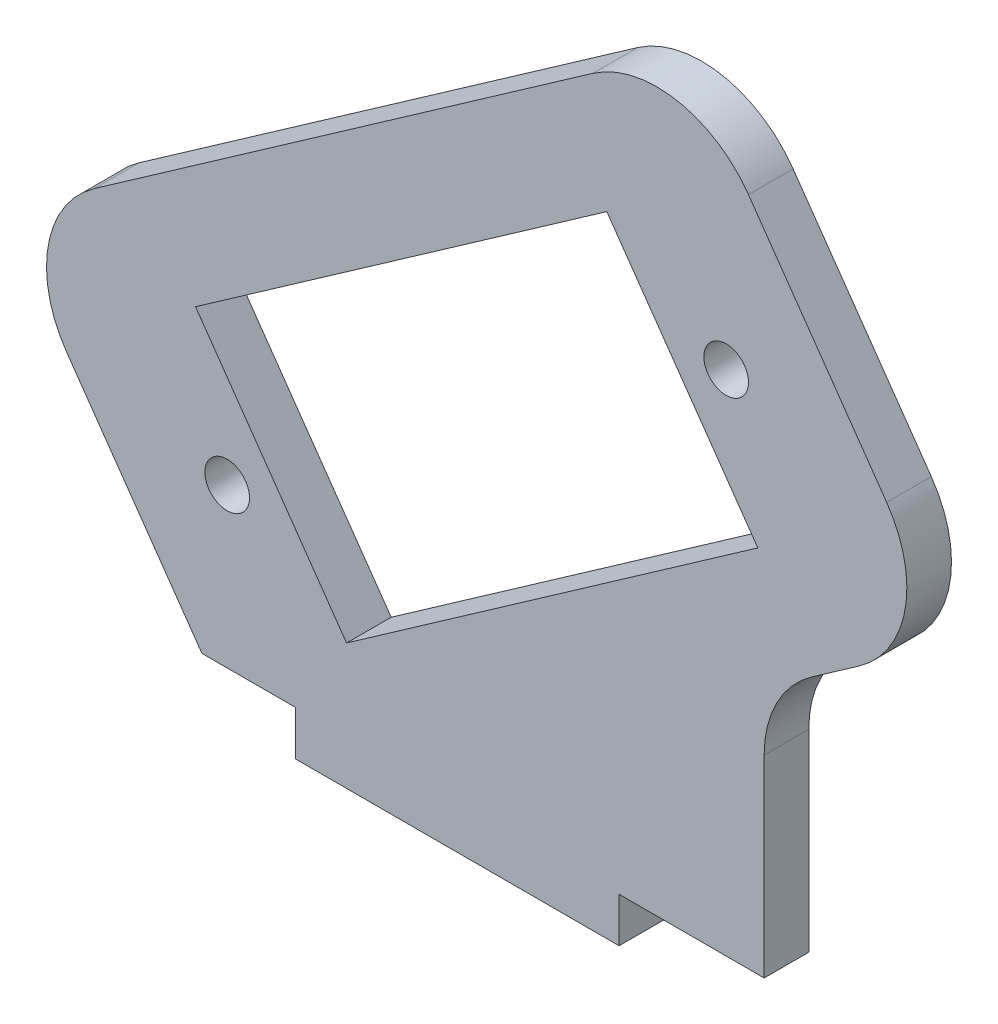
ISO-10303-21;
HEADER;
FILE_DESCRIPTION(('STEP AP214'),'2;1');
FILE_NAME('part.step','',(''),(''),'','','');
FILE_SCHEMA(('AUTOMOTIVE_DESIGN { 1 0 10303 214 1 1 1 1 }'));
ENDSEC;
DATA;
#1=APPLICATION_CONTEXT('core data for automotive mechanical design processes');
#2=APPLICATION_PROTOCOL_DEFINITION('international standard','automotive_design',2000,#1);
#3=PRODUCT_CONTEXT('',#1,'mechanical');
#4=PRODUCT('Part','Part','',(#3));
#5=PRODUCT_RELATED_PRODUCT_CATEGORY('part','',(#4));
#6=PRODUCT_DEFINITION_FORMATION('','',#4);
#7=PRODUCT_DEFINITION_CONTEXT('part definition',#1,'design');
#8=PRODUCT_DEFINITION('design','',#6,#7);
#9=PRODUCT_DEFINITION_SHAPE('','',#8);
#10=(LENGTH_UNIT() NAMED_UNIT(*) SI_UNIT(.MILLI.,.METRE.));
#11=(NAMED_UNIT(*) PLANE_ANGLE_UNIT() SI_UNIT($,.RADIAN.));
#12=(NAMED_UNIT(*) SI_UNIT($,.STERADIAN.) SOLID_ANGLE_UNIT());
#13=UNCERTAINTY_MEASURE_WITH_UNIT(LENGTH_MEASURE(1.E-05),#10,'distance_accuracy_value','');
#14=(GEOMETRIC_REPRESENTATION_CONTEXT(3) GLOBAL_UNCERTAINTY_ASSIGNED_CONTEXT((#13)) GLOBAL_UNIT_ASSIGNED_CONTEXT((#10,
#11,#12)) REPRESENTATION_CONTEXT('',''));
#15=CARTESIAN_POINT('',(0.,0.,0.));
#16=DIRECTION('',(0.,0.,1.));
#17=DIRECTION('',(1.,0.,0.));
#18=AXIS2_PLACEMENT_3D('',#15,#16,#17);
#19=CARTESIAN_POINT('',(-6.16120159778652,13.5254687484908,2.));
#20=DIRECTION('',(0.,0.,1.));
#21=DIRECTION('',(1.,0.,0.));
#22=AXIS2_PLACEMENT_3D('',#19,#20,#21);
#23=PLANE('',#22);
#24=CARTESIAN_POINT('',(-3.0638888414909,9.10204770933021,2.));
#25=DIRECTION('',(0.,0.,1.));
#26=DIRECTION('',(1.,0.,0.));
#27=AXIS2_PLACEMENT_3D('',#24,#25,#26);
#28=CIRCLE('',#27,0.999999999999996);
#29=CARTESIAN_POINT('',(-2.0638888414909,9.10204770933021,2.));
#30=VERTEX_POINT('',#29);
#31=EDGE_CURVE('E191',#30,#30,#28,.T.);
#32=ORIENTED_EDGE('',*,*,#31,.F.);
#33=EDGE_LOOP('',(#32));
#34=FACE_BOUND('',#33,.T.);
#35=DIRECTION('',(0.,-1.,0.));
#36=VECTOR('',#35,1.);
#37=CARTESIAN_POINT('',(0.,0.,2.));
#38=LINE('',#37,#36);
#39=CARTESIAN_POINT('',(0.,2.,2.));
#40=VERTEX_POINT('',#39);
#41=CARTESIAN_POINT('',(0.,0.,2.));
#42=VERTEX_POINT('',#41);
#43=EDGE_CURVE('E201',#40,#42,#38,.T.);
#44=ORIENTED_EDGE('',*,*,#43,.T.);
#45=DIRECTION('',(1.,0.,0.));
#46=VECTOR('',#45,1.);
#47=CARTESIAN_POINT('',(0.,0.,2.));
#48=LINE('',#47,#46);
#49=CARTESIAN_POINT('',(14.5,0.,2.));
#50=VERTEX_POINT('',#49);
#51=EDGE_CURVE('E204',#42,#50,#48,.T.);
#52=ORIENTED_EDGE('',*,*,#51,.T.);
#53=DIRECTION('',(0.,1.,0.));
#54=VECTOR('',#53,1.);
#55=CARTESIAN_POINT('',(14.5,0.,2.));
#56=LINE('',#55,#54);
#57=CARTESIAN_POINT('',(14.5,2.,2.));
#58=VERTEX_POINT('',#57);
#59=EDGE_CURVE('E207',#50,#58,#56,.T.);
#60=ORIENTED_EDGE('',*,*,#59,.T.);
#61=DIRECTION('',(1.,0.,0.));
#62=VECTOR('',#61,1.);
#63=CARTESIAN_POINT('',(14.5,2.,2.));
#64=LINE('',#63,#62);
#65=CARTESIAN_POINT('',(21.,2.,2.));
#66=VERTEX_POINT('',#65);
#67=EDGE_CURVE('E209',#58,#66,#64,.T.);
#68=ORIENTED_EDGE('',*,*,#67,.T.);
#69=DIRECTION('',(0.,1.,0.));
#70=VECTOR('',#69,1.);
#71=CARTESIAN_POINT('',(21.,2.,2.));
#72=LINE('',#71,#70);
#73=CARTESIAN_POINT('',(21.,10.6528730989046,2.));
#74=VERTEX_POINT('',#73);
#75=EDGE_CURVE('E211',#66,#74,#72,.T.);
#76=ORIENTED_EDGE('',*,*,#75,.T.);
#77=CARTESIAN_POINT('',(26.,10.6528730989046,2.));
#78=DIRECTION('',(0.,0.,-1.));
#79=DIRECTION('',(-1.,0.,0.));
#80=AXIS2_PLACEMENT_3D('',#77,#78,#79);
#81=CIRCLE('',#80,5.);
#82=CARTESIAN_POINT('',(23.1321178182448,14.7486333203496,2.));
#83=VERTEX_POINT('',#82);
#84=EDGE_CURVE('E213',#74,#83,#81,.T.);
#85=ORIENTED_EDGE('',*,*,#84,.T.);
#86=DIRECTION('',(0.819152044288995,0.573576436351042,0.));
#87=VECTOR('',#86,1.);
#88=CARTESIAN_POINT('',(23.1321178182448,14.7486333203496,2.));
#89=LINE('',#88,#87);
#90=CARTESIAN_POINT('',(25.2641569056495,16.2415031611081,2.));
#91=VERTEX_POINT('',#90);
#92=EDGE_CURVE('E215',#83,#91,#89,.T.);
#93=ORIENTED_EDGE('',*,*,#92,.T.);
#94=CARTESIAN_POINT('',(22.3962747238943,20.3372633825531,2.));
#95=DIRECTION('',(0.,0.,1.));
#96=DIRECTION('',(1.,0.,0.));
#97=AXIS2_PLACEMENT_3D('',#94,#95,#96);
#98=CIRCLE('',#97,5.);
#99=CARTESIAN_POINT('',(26.4920349453392,23.2051455643083,2.));
#100=VERTEX_POINT('',#99);
#101=EDGE_CURVE('E217',#91,#100,#98,.T.);
#102=ORIENTED_EDGE('',*,*,#101,.T.);
#103=DIRECTION('',(-0.573576436351042,0.819152044288995,0.));
#104=VECTOR('',#103,1.);
#105=CARTESIAN_POINT('',(26.4920349453392,23.2051455643083,2.));
#106=LINE('',#105,#104);
#107=CARTESIAN_POINT('',(20.297409432748,32.0519876426294,2.));
#108=VERTEX_POINT('',#107);
#109=EDGE_CURVE('E219',#100,#108,#106,.T.);
#110=ORIENTED_EDGE('',*,*,#109,.T.);
#111=CARTESIAN_POINT('',(16.201649211303,29.1841054608742,2.));
#112=DIRECTION('',(0.,0.,1.));
#113=DIRECTION('',(1.,0.,0.));
#114=AXIS2_PLACEMENT_3D('',#111,#112,#113);
#115=CIRCLE('',#114,5.);
#116=CARTESIAN_POINT('',(13.3337670295478,33.2798656823192,2.));
#117=VERTEX_POINT('',#116);
#118=EDGE_CURVE('E221',#108,#117,#115,.T.);
#119=ORIENTED_EDGE('',*,*,#118,.T.);
#120=DIRECTION('',(-0.819152044288995,-0.573576436351042,0.));
#121=VECTOR('',#120,1.);
#122=CARTESIAN_POINT('',(13.3337670295478,33.2798656823192,2.));
#123=LINE('',#122,#121);
#124=CARTESIAN_POINT('',(-9.0290837795417,17.6212289699358,2.));
#125=VERTEX_POINT('',#124);
#126=EDGE_CURVE('E223',#117,#125,#123,.T.);
#127=ORIENTED_EDGE('',*,*,#126,.T.);
#128=CARTESIAN_POINT('',(-6.16120159778652,13.5254687484908,2.));
#129=DIRECTION('',(0.,0.,1.));
#130=DIRECTION('',(1.,0.,0.));
#131=AXIS2_PLACEMENT_3D('',#128,#129,#130);
#132=CIRCLE('',#131,5.);
#133=CARTESIAN_POINT('',(-10.2569618192315,10.6575865667355,2.));
#134=VERTEX_POINT('',#133);
#135=EDGE_CURVE('E225',#125,#134,#132,.T.);
#136=ORIENTED_EDGE('',*,*,#135,.T.);
#137=DIRECTION('',(0.573576436351042,-0.819152044288995,0.));
#138=VECTOR('',#137,1.);
#139=CARTESIAN_POINT('',(-10.2569618192315,10.6575865667355,2.));
#140=LINE('',#139,#138);
#141=CARTESIAN_POINT('',(-4.1948544425002,2.,2.));
#142=VERTEX_POINT('',#141);
#143=EDGE_CURVE('E227',#134,#142,#140,.T.);
#144=ORIENTED_EDGE('',*,*,#143,.T.);
#145=DIRECTION('',(1.,0.,0.));
#146=VECTOR('',#145,1.);
#147=CARTESIAN_POINT('',(0.,2.,2.));
#148=LINE('',#147,#146);
#149=EDGE_CURVE('E229',#142,#40,#148,.T.);
#150=ORIENTED_EDGE('',*,*,#149,.T.);
#151=EDGE_LOOP('',(#44,#52,#60,#68,#76,#85,#93,#102,#110,#119,#127,#136,#144,#150));
#152=FACE_BOUND('',#151,.T.);
#153=DIRECTION('',(0.819152044288995,0.573576436351041,0.));
#154=VECTOR('',#153,1.);
#155=CARTESIAN_POINT('',(20.7170980357762,18.5511039131661,2.));
#156=LINE('',#155,#154);
#157=CARTESIAN_POINT('',(2.28617703927383,5.64563409526764,2.));
#158=VERTEX_POINT('',#157);
#159=CARTESIAN_POINT('',(20.7170980357762,18.5511039131661,2.));
#160=VERTEX_POINT('',#159);
#161=EDGE_CURVE('E170',#158,#160,#156,.T.);
#162=ORIENTED_EDGE('',*,*,#161,.F.);
#163=DIRECTION('',(0.573576436351042,-0.819152044288995,0.));
#164=VECTOR('',#163,1.);
#165=CARTESIAN_POINT('',(2.28617703927383,5.64563409526764,2.));
#166=LINE('',#165,#164);
#167=CARTESIAN_POINT('',(-4.48202490966846,15.3116282178778,2.));
#168=VERTEX_POINT('',#167);
#169=EDGE_CURVE('E162',#168,#158,#166,.T.);
#170=ORIENTED_EDGE('',*,*,#169,.F.);
#171=DIRECTION('',(-0.819152044288995,-0.573576436351042,0.));
#172=VECTOR('',#171,1.);
#173=CARTESIAN_POINT('',(-4.48202490966846,15.3116282178778,2.));
#174=LINE('',#173,#172);
#175=CARTESIAN_POINT('',(13.9488960868339,28.2170980357762,2.));
#176=VERTEX_POINT('',#175);
#177=EDGE_CURVE('E185',#176,#168,#174,.T.);
#178=ORIENTED_EDGE('',*,*,#177,.F.);
#179=DIRECTION('',(-0.573576436351041,0.819152044288995,0.));
#180=VECTOR('',#179,1.);
#181=CARTESIAN_POINT('',(13.9488960868339,28.2170980357762,2.));
#182=LINE('',#181,#180);
#183=EDGE_CURVE('E183',#160,#176,#182,.T.);
#184=ORIENTED_EDGE('',*,*,#183,.F.);
#185=EDGE_LOOP('',(#162,#170,#178,#184));
#186=FACE_BOUND('',#185,.T.);
#187=CARTESIAN_POINT('',(19.2989619675987,24.7606844217136,2.));
#188=DIRECTION('',(0.,0.,1.));
#189=DIRECTION('',(1.,0.,0.));
#190=AXIS2_PLACEMENT_3D('',#187,#188,#189);
#191=CIRCLE('',#190,0.999999999999998);
#192=CARTESIAN_POINT('',(20.2989619675987,24.7606844217136,2.));
#193=VERTEX_POINT('',#192);
#194=EDGE_CURVE('E471',#193,#193,#191,.T.);
#195=ORIENTED_EDGE('',*,*,#194,.F.);
#196=EDGE_LOOP('',(#195));
#197=FACE_BOUND('',#196,.T.);
#198=ADVANCED_FACE('F37',(#34,#152,#186,#197),#23,.T.);
#199=CARTESIAN_POINT('',(-6.16120159778652,13.5254687484908,0.));
#200=DIRECTION('',(0.,0.,1.));
#201=DIRECTION('',(1.,0.,0.));
#202=AXIS2_PLACEMENT_3D('',#199,#200,#201);
#203=PLANE('',#202);
#204=DIRECTION('',(0.,-1.,0.));
#205=VECTOR('',#204,1.);
#206=CARTESIAN_POINT('',(0.,0.,0.));
#207=LINE('',#206,#205);
#208=CARTESIAN_POINT('',(0.,2.,0.));
#209=VERTEX_POINT('',#208);
#210=CARTESIAN_POINT('',(0.,0.,0.));
#211=VERTEX_POINT('',#210);
#212=EDGE_CURVE('E178',#209,#211,#207,.T.);
#213=ORIENTED_EDGE('',*,*,#212,.F.);
#214=DIRECTION('',(1.,0.,0.));
#215=VECTOR('',#214,1.);
#216=CARTESIAN_POINT('',(0.,2.,0.));
#217=LINE('',#216,#215);
#218=CARTESIAN_POINT('',(-4.1948544425002,2.,0.));
#219=VERTEX_POINT('',#218);
#220=EDGE_CURVE('E205',#219,#209,#217,.T.);
#221=ORIENTED_EDGE('',*,*,#220,.F.);
#222=DIRECTION('',(0.573576436351042,-0.819152044288995,0.));
#223=VECTOR('',#222,1.);
#224=CARTESIAN_POINT('',(-10.2569618192315,10.6575865667355,0.));
#225=LINE('',#224,#223);
#226=CARTESIAN_POINT('',(-10.2569618192315,10.6575865667355,0.));
#227=VERTEX_POINT('',#226);
#228=EDGE_CURVE('E256',#227,#219,#225,.T.);
#229=ORIENTED_EDGE('',*,*,#228,.F.);
#230=CARTESIAN_POINT('',(-6.16120159778652,13.5254687484908,0.));
#231=DIRECTION('',(0.,0.,1.));
#232=DIRECTION('',(1.,0.,0.));
#233=AXIS2_PLACEMENT_3D('',#230,#231,#232);
#234=CIRCLE('',#233,5.);
#235=CARTESIAN_POINT('',(-9.0290837795417,17.6212289699358,0.));
#236=VERTEX_POINT('',#235);
#237=EDGE_CURVE('E254',#236,#227,#234,.T.);
#238=ORIENTED_EDGE('',*,*,#237,.F.);
#239=DIRECTION('',(-0.819152044288995,-0.573576436351042,0.));
#240=VECTOR('',#239,1.);
#241=CARTESIAN_POINT('',(13.3337670295478,33.2798656823192,0.));
#242=LINE('',#241,#240);
#243=CARTESIAN_POINT('',(13.3337670295478,33.2798656823192,0.));
#244=VERTEX_POINT('',#243);
#245=EDGE_CURVE('E252',#244,#236,#242,.T.);
#246=ORIENTED_EDGE('',*,*,#245,.F.);
#247=CARTESIAN_POINT('',(16.201649211303,29.1841054608742,0.));
#248=DIRECTION('',(0.,0.,1.));
#249=DIRECTION('',(1.,0.,0.));
#250=AXIS2_PLACEMENT_3D('',#247,#248,#249);
#251=CIRCLE('',#250,5.);
#252=CARTESIAN_POINT('',(20.297409432748,32.0519876426294,0.));
#253=VERTEX_POINT('',#252);
#254=EDGE_CURVE('E250',#253,#244,#251,.T.);
#255=ORIENTED_EDGE('',*,*,#254,.F.);
#256=DIRECTION('',(-0.573576436351042,0.819152044288995,0.));
#257=VECTOR('',#256,1.);
#258=CARTESIAN_POINT('',(26.4920349453392,23.2051455643083,0.));
#259=LINE('',#258,#257);
#260=CARTESIAN_POINT('',(26.4920349453392,23.2051455643083,0.));
#261=VERTEX_POINT('',#260);
#262=EDGE_CURVE('E248',#261,#253,#259,.T.);
#263=ORIENTED_EDGE('',*,*,#262,.F.);
#264=CARTESIAN_POINT('',(22.3962747238943,20.3372633825531,0.));
#265=DIRECTION('',(0.,0.,1.));
#266=DIRECTION('',(1.,0.,0.));
#267=AXIS2_PLACEMENT_3D('',#264,#265,#266);
#268=CIRCLE('',#267,5.);
#269=CARTESIAN_POINT('',(25.2641569056495,16.2415031611081,0.));
#270=VERTEX_POINT('',#269);
#271=EDGE_CURVE('E246',#270,#261,#268,.T.);
#272=ORIENTED_EDGE('',*,*,#271,.F.);
#273=DIRECTION('',(0.819152044288995,0.573576436351042,0.));
#274=VECTOR('',#273,1.);
#275=CARTESIAN_POINT('',(23.1321178182448,14.7486333203496,0.));
#276=LINE('',#275,#274);
#277=CARTESIAN_POINT('',(23.1321178182448,14.7486333203496,0.));
#278=VERTEX_POINT('',#277);
#279=EDGE_CURVE('E244',#278,#270,#276,.T.);
#280=ORIENTED_EDGE('',*,*,#279,.F.);
#281=CARTESIAN_POINT('',(26.,10.6528730989046,0.));
#282=DIRECTION('',(0.,0.,-1.));
#283=DIRECTION('',(-1.,0.,0.));
#284=AXIS2_PLACEMENT_3D('',#281,#282,#283);
#285=CIRCLE('',#284,5.);
#286=CARTESIAN_POINT('',(21.,10.6528730989046,0.));
#287=VERTEX_POINT('',#286);
#288=EDGE_CURVE('E242',#287,#278,#285,.T.);
#289=ORIENTED_EDGE('',*,*,#288,.F.);
#290=DIRECTION('',(0.,1.,0.));
#291=VECTOR('',#290,1.);
#292=CARTESIAN_POINT('',(21.,2.,0.));
#293=LINE('',#292,#291);
#294=CARTESIAN_POINT('',(21.,2.,0.));
#295=VERTEX_POINT('',#294);
#296=EDGE_CURVE('E240',#295,#287,#293,.T.);
#297=ORIENTED_EDGE('',*,*,#296,.F.);
#298=DIRECTION('',(1.,0.,0.));
#299=VECTOR('',#298,1.);
#300=CARTESIAN_POINT('',(14.5,2.,0.));
#301=LINE('',#300,#299);
#302=CARTESIAN_POINT('',(14.5,2.,0.));
#303=VERTEX_POINT('',#302);
#304=EDGE_CURVE('E238',#303,#295,#301,.T.);
#305=ORIENTED_EDGE('',*,*,#304,.F.);
#306=DIRECTION('',(0.,1.,0.));
#307=VECTOR('',#306,1.);
#308=CARTESIAN_POINT('',(14.5,0.,0.));
#309=LINE('',#308,#307);
#310=CARTESIAN_POINT('',(14.5,0.,0.));
#311=VERTEX_POINT('',#310);
#312=EDGE_CURVE('E236',#311,#303,#309,.T.);
#313=ORIENTED_EDGE('',*,*,#312,.F.);
#314=DIRECTION('',(1.,0.,0.));
#315=VECTOR('',#314,1.);
#316=CARTESIAN_POINT('',(0.,0.,0.));
#317=LINE('',#316,#315);
#318=EDGE_CURVE('E234',#211,#311,#317,.T.);
#319=ORIENTED_EDGE('',*,*,#318,.F.);
#320=EDGE_LOOP('',(#213,#221,#229,#238,#246,#255,#263,#272,#280,#289,#297,#305,#313,#319));
#321=FACE_BOUND('',#320,.T.);
#322=DIRECTION('',(0.573576436351042,-0.819152044288995,0.));
#323=VECTOR('',#322,1.);
#324=CARTESIAN_POINT('',(2.28617703927383,5.64563409526764,0.));
#325=LINE('',#324,#323);
#326=CARTESIAN_POINT('',(-4.48202490966846,15.3116282178778,0.));
#327=VERTEX_POINT('',#326);
#328=CARTESIAN_POINT('',(2.28617703927383,5.64563409526764,0.));
#329=VERTEX_POINT('',#328);
#330=EDGE_CURVE('E60',#327,#329,#325,.T.);
#331=ORIENTED_EDGE('',*,*,#330,.T.);
#332=DIRECTION('',(0.819152044288995,0.573576436351041,0.));
#333=VECTOR('',#332,1.);
#334=CARTESIAN_POINT('',(20.7170980357762,18.5511039131661,0.));
#335=LINE('',#334,#333);
#336=CARTESIAN_POINT('',(20.7170980357762,18.5511039131661,0.));
#337=VERTEX_POINT('',#336);
#338=EDGE_CURVE('E177',#329,#337,#335,.T.);
#339=ORIENTED_EDGE('',*,*,#338,.T.);
#340=DIRECTION('',(-0.573576436351041,0.819152044288995,0.));
#341=VECTOR('',#340,1.);
#342=CARTESIAN_POINT('',(13.9488960868339,28.2170980357762,0.));
#343=LINE('',#342,#341);
#344=CARTESIAN_POINT('',(13.9488960868339,28.2170980357762,0.));
#345=VERTEX_POINT('',#344);
#346=EDGE_CURVE('E193',#337,#345,#343,.T.);
#347=ORIENTED_EDGE('',*,*,#346,.T.);
#348=DIRECTION('',(-0.819152044288995,-0.573576436351042,0.));
#349=VECTOR('',#348,1.);
#350=CARTESIAN_POINT('',(-4.48202490966846,15.3116282178778,0.));
#351=LINE('',#350,#349);
#352=EDGE_CURVE('E171',#345,#327,#351,.T.);
#353=ORIENTED_EDGE('',*,*,#352,.T.);
#354=EDGE_LOOP('',(#331,#339,#347,#353));
#355=FACE_BOUND('',#354,.T.);
#356=CARTESIAN_POINT('',(-3.0638888414909,9.10204770933021,0.));
#357=DIRECTION('',(0.,0.,1.));
#358=DIRECTION('',(1.,0.,0.));
#359=AXIS2_PLACEMENT_3D('',#356,#357,#358);
#360=CIRCLE('',#359,0.999999999999996);
#361=CARTESIAN_POINT('',(-2.0638888414909,9.10204770933021,0.));
#362=VERTEX_POINT('',#361);
#363=EDGE_CURVE('E477',#362,#362,#360,.T.);
#364=ORIENTED_EDGE('',*,*,#363,.T.);
#365=EDGE_LOOP('',(#364));
#366=FACE_BOUND('',#365,.T.);
#367=CARTESIAN_POINT('',(19.2989619675987,24.7606844217136,0.));
#368=DIRECTION('',(0.,0.,1.));
#369=DIRECTION('',(1.,0.,0.));
#370=AXIS2_PLACEMENT_3D('',#367,#368,#369);
#371=CIRCLE('',#370,0.999999999999998);
#372=CARTESIAN_POINT('',(20.2989619675987,24.7606844217136,0.));
#373=VERTEX_POINT('',#372);
#374=EDGE_CURVE('E474',#373,#373,#371,.T.);
#375=ORIENTED_EDGE('',*,*,#374,.T.);
#376=EDGE_LOOP('',(#375));
#377=FACE_BOUND('',#376,.T.);
#378=ADVANCED_FACE('F304',(#321,#355,#366,#377),#203,.F.);
#379=CARTESIAN_POINT('',(0.,0.,2.));
#380=DIRECTION('',(1.,0.,0.));
#381=DIRECTION('',(0.,0.,-1.));
#382=AXIS2_PLACEMENT_3D('',#379,#380,#381);
#383=PLANE('',#382);
#384=ORIENTED_EDGE('',*,*,#212,.T.);
#385=DIRECTION('',(0.,0.,-1.));
#386=VECTOR('',#385,1.);
#387=CARTESIAN_POINT('',(0.,0.,2.));
#388=LINE('',#387,#386);
#389=EDGE_CURVE('E11',#42,#211,#388,.T.);
#390=ORIENTED_EDGE('',*,*,#389,.F.);
#391=ORIENTED_EDGE('',*,*,#43,.F.);
#392=DIRECTION('',(0.,0.,-1.));
#393=VECTOR('',#392,1.);
#394=CARTESIAN_POINT('',(0.,2.,2.));
#395=LINE('',#394,#393);
#396=EDGE_CURVE('E231',#40,#209,#395,.T.);
#397=ORIENTED_EDGE('',*,*,#396,.T.);
#398=EDGE_LOOP('',(#384,#390,#391,#397));
#399=FACE_BOUND('',#398,.T.);
#400=ADVANCED_FACE('F39',(#399),#383,.F.);
#401=CARTESIAN_POINT('',(0.,0.,2.));
#402=DIRECTION('',(0.,1.,0.));
#403=DIRECTION('',(0.,0.,1.));
#404=AXIS2_PLACEMENT_3D('',#401,#402,#403);
#405=PLANE('',#404);
#406=ORIENTED_EDGE('',*,*,#318,.T.);
#407=DIRECTION('',(0.,0.,-1.));
#408=VECTOR('',#407,1.);
#409=CARTESIAN_POINT('',(14.5,0.,2.));
#410=LINE('',#409,#408);
#411=EDGE_CURVE('E45',#50,#311,#410,.T.);
#412=ORIENTED_EDGE('',*,*,#411,.F.);
#413=ORIENTED_EDGE('',*,*,#51,.F.);
#414=ORIENTED_EDGE('',*,*,#389,.T.);
#415=EDGE_LOOP('',(#406,#412,#413,#414));
#416=FACE_BOUND('',#415,.T.);
#417=ADVANCED_FACE('F321',(#416),#405,.F.);
#418=CARTESIAN_POINT('',(14.5,0.,2.));
#419=DIRECTION('',(-1.,0.,0.));
#420=DIRECTION('',(0.,0.,1.));
#421=AXIS2_PLACEMENT_3D('',#418,#419,#420);
#422=PLANE('',#421);
#423=ORIENTED_EDGE('',*,*,#312,.T.);
#424=DIRECTION('',(0.,0.,-1.));
#425=VECTOR('',#424,1.);
#426=CARTESIAN_POINT('',(14.5,2.,2.));
#427=LINE('',#426,#425);
#428=EDGE_CURVE('E291',#58,#303,#427,.T.);
#429=ORIENTED_EDGE('',*,*,#428,.F.);
#430=ORIENTED_EDGE('',*,*,#59,.F.);
#431=ORIENTED_EDGE('',*,*,#411,.T.);
#432=EDGE_LOOP('',(#423,#429,#430,#431));
#433=FACE_BOUND('',#432,.T.);
#434=ADVANCED_FACE('F298',(#433),#422,.F.);
#435=CARTESIAN_POINT('',(14.5,2.,2.));
#436=DIRECTION('',(0.,1.,0.));
#437=DIRECTION('',(-1.,0.,0.));
#438=AXIS2_PLACEMENT_3D('',#435,#436,#437);
#439=PLANE('',#438);
#440=ORIENTED_EDGE('',*,*,#304,.T.);
#441=DIRECTION('',(0.,0.,-1.));
#442=VECTOR('',#441,1.);
#443=CARTESIAN_POINT('',(21.,2.,2.));
#444=LINE('',#443,#442);
#445=EDGE_CURVE('E288',#66,#295,#444,.T.);
#446=ORIENTED_EDGE('',*,*,#445,.F.);
#447=ORIENTED_EDGE('',*,*,#67,.F.);
#448=ORIENTED_EDGE('',*,*,#428,.T.);
#449=EDGE_LOOP('',(#440,#446,#447,#448));
#450=FACE_BOUND('',#449,.T.);
#451=ADVANCED_FACE('F310',(#450),#439,.F.);
#452=CARTESIAN_POINT('',(21.,2.,2.));
#453=DIRECTION('',(-1.,0.,0.));
#454=DIRECTION('',(0.,0.,1.));
#455=AXIS2_PLACEMENT_3D('',#452,#453,#454);
#456=PLANE('',#455);
#457=ORIENTED_EDGE('',*,*,#296,.T.);
#458=DIRECTION('',(0.,0.,-1.));
#459=VECTOR('',#458,1.);
#460=CARTESIAN_POINT('',(21.,10.6528730989046,2.));
#461=LINE('',#460,#459);
#462=EDGE_CURVE('E285',#74,#287,#461,.T.);
#463=ORIENTED_EDGE('',*,*,#462,.F.);
#464=ORIENTED_EDGE('',*,*,#75,.F.);
#465=ORIENTED_EDGE('',*,*,#445,.T.);
#466=EDGE_LOOP('',(#457,#463,#464,#465));
#467=FACE_BOUND('',#466,.T.);
#468=ADVANCED_FACE('F314',(#467),#456,.F.);
#469=CARTESIAN_POINT('',(26.,10.6528730989046,2.));
#470=DIRECTION('',(0.,0.,-1.));
#471=DIRECTION('',(-1.,0.,0.));
#472=AXIS2_PLACEMENT_3D('',#469,#470,#471);
#473=CYLINDRICAL_SURFACE('',#472,5.);
#474=ORIENTED_EDGE('',*,*,#288,.T.);
#475=DIRECTION('',(0.,0.,-1.));
#476=VECTOR('',#475,1.);
#477=CARTESIAN_POINT('',(23.1321178182448,14.7486333203496,2.));
#478=LINE('',#477,#476);
#479=EDGE_CURVE('E282',#83,#278,#478,.T.);
#480=ORIENTED_EDGE('',*,*,#479,.F.);
#481=ORIENTED_EDGE('',*,*,#84,.F.);
#482=ORIENTED_EDGE('',*,*,#462,.T.);
#483=EDGE_LOOP('',(#474,#480,#481,#482));
#484=FACE_BOUND('',#483,.T.);
#485=ADVANCED_FACE('F364',(#484),#473,.F.);
#486=CARTESIAN_POINT('',(23.1321178182448,14.7486333203496,2.));
#487=DIRECTION('',(-0.573576436351042,0.819152044288995,0.));
#488=DIRECTION('',(-0.819152044288995,-0.573576436351042,0.));
#489=AXIS2_PLACEMENT_3D('',#486,#487,#488);
#490=PLANE('',#489);
#491=ORIENTED_EDGE('',*,*,#279,.T.);
#492=DIRECTION('',(0.,0.,-1.));
#493=VECTOR('',#492,1.);
#494=CARTESIAN_POINT('',(25.2641569056495,16.2415031611081,2.));
#495=LINE('',#494,#493);
#496=EDGE_CURVE('E279',#91,#270,#495,.T.);
#497=ORIENTED_EDGE('',*,*,#496,.F.);
#498=ORIENTED_EDGE('',*,*,#92,.F.);
#499=ORIENTED_EDGE('',*,*,#479,.T.);
#500=EDGE_LOOP('',(#491,#497,#498,#499));
#501=FACE_BOUND('',#500,.T.);
#502=ADVANCED_FACE('F362',(#501),#490,.F.);
#503=CARTESIAN_POINT('',(22.3962747238943,20.3372633825531,2.));
#504=DIRECTION('',(0.,0.,-1.));
#505=DIRECTION('',(-1.,0.,0.));
#506=AXIS2_PLACEMENT_3D('',#503,#504,#505);
#507=CYLINDRICAL_SURFACE('',#506,5.);
#508=ORIENTED_EDGE('',*,*,#271,.T.);
#509=DIRECTION('',(0.,0.,-1.));
#510=VECTOR('',#509,1.);
#511=CARTESIAN_POINT('',(26.4920349453392,23.2051455643083,2.));
#512=LINE('',#511,#510);
#513=EDGE_CURVE('E276',#100,#261,#512,.T.);
#514=ORIENTED_EDGE('',*,*,#513,.F.);
#515=ORIENTED_EDGE('',*,*,#101,.F.);
#516=ORIENTED_EDGE('',*,*,#496,.T.);
#517=EDGE_LOOP('',(#508,#514,#515,#516));
#518=FACE_BOUND('',#517,.T.);
#519=ADVANCED_FACE('F357',(#518),#507,.T.);
#520=CARTESIAN_POINT('',(26.4920349453392,23.2051455643083,2.));
#521=DIRECTION('',(-0.819152044288995,-0.573576436351042,0.));
#522=DIRECTION('',(0.573576436351042,-0.819152044288995,0.));
#523=AXIS2_PLACEMENT_3D('',#520,#521,#522);
#524=PLANE('',#523);
#525=ORIENTED_EDGE('',*,*,#262,.T.);
#526=DIRECTION('',(0.,0.,-1.));
#527=VECTOR('',#526,1.);
#528=CARTESIAN_POINT('',(20.297409432748,32.0519876426294,2.));
#529=LINE('',#528,#527);
#530=EDGE_CURVE('E273',#108,#253,#529,.T.);
#531=ORIENTED_EDGE('',*,*,#530,.F.);
#532=ORIENTED_EDGE('',*,*,#109,.F.);
#533=ORIENTED_EDGE('',*,*,#513,.T.);
#534=EDGE_LOOP('',(#525,#531,#532,#533));
#535=FACE_BOUND('',#534,.T.);
#536=ADVANCED_FACE('F352',(#535),#524,.F.);
#537=CARTESIAN_POINT('',(16.201649211303,29.1841054608742,2.));
#538=DIRECTION('',(0.,0.,-1.));
#539=DIRECTION('',(-1.,0.,0.));
#540=AXIS2_PLACEMENT_3D('',#537,#538,#539);
#541=CYLINDRICAL_SURFACE('',#540,5.);
#542=ORIENTED_EDGE('',*,*,#254,.T.);
#543=DIRECTION('',(0.,0.,-1.));
#544=VECTOR('',#543,1.);
#545=CARTESIAN_POINT('',(13.3337670295478,33.2798656823192,2.));
#546=LINE('',#545,#544);
#547=EDGE_CURVE('E270',#117,#244,#546,.T.);
#548=ORIENTED_EDGE('',*,*,#547,.F.);
#549=ORIENTED_EDGE('',*,*,#118,.F.);
#550=ORIENTED_EDGE('',*,*,#530,.T.);
#551=EDGE_LOOP('',(#542,#548,#549,#550));
#552=FACE_BOUND('',#551,.T.);
#553=ADVANCED_FACE('F348',(#552),#541,.T.);
#554=CARTESIAN_POINT('',(13.3337670295478,33.2798656823192,2.));
#555=DIRECTION('',(0.573576436351042,-0.819152044288995,0.));
#556=DIRECTION('',(0.819152044288995,0.573576436351042,0.));
#557=AXIS2_PLACEMENT_3D('',#554,#555,#556);
#558=PLANE('',#557);
#559=ORIENTED_EDGE('',*,*,#245,.T.);
#560=DIRECTION('',(0.,0.,-1.));
#561=VECTOR('',#560,1.);
#562=CARTESIAN_POINT('',(-9.0290837795417,17.6212289699358,2.));
#563=LINE('',#562,#561);
#564=EDGE_CURVE('E267',#125,#236,#563,.T.);
#565=ORIENTED_EDGE('',*,*,#564,.F.);
#566=ORIENTED_EDGE('',*,*,#126,.F.);
#567=ORIENTED_EDGE('',*,*,#547,.T.);
#568=EDGE_LOOP('',(#559,#565,#566,#567));
#569=FACE_BOUND('',#568,.T.);
#570=ADVANCED_FACE('F343',(#569),#558,.F.);
#571=CARTESIAN_POINT('',(-6.16120159778652,13.5254687484908,2.));
#572=DIRECTION('',(0.,0.,-1.));
#573=DIRECTION('',(-1.,0.,0.));
#574=AXIS2_PLACEMENT_3D('',#571,#572,#573);
#575=CYLINDRICAL_SURFACE('',#574,5.);
#576=ORIENTED_EDGE('',*,*,#237,.T.);
#577=DIRECTION('',(0.,0.,-1.));
#578=VECTOR('',#577,1.);
#579=CARTESIAN_POINT('',(-10.2569618192315,10.6575865667355,2.));
#580=LINE('',#579,#578);
#581=EDGE_CURVE('E264',#134,#227,#580,.T.);
#582=ORIENTED_EDGE('',*,*,#581,.F.);
#583=ORIENTED_EDGE('',*,*,#135,.F.);
#584=ORIENTED_EDGE('',*,*,#564,.T.);
#585=EDGE_LOOP('',(#576,#582,#583,#584));
#586=FACE_BOUND('',#585,.T.);
#587=ADVANCED_FACE('F337',(#586),#575,.T.);
#588=CARTESIAN_POINT('',(-10.2569618192315,10.6575865667355,2.));
#589=DIRECTION('',(0.819152044288995,0.573576436351042,0.));
#590=DIRECTION('',(-0.573576436351042,0.819152044288995,0.));
#591=AXIS2_PLACEMENT_3D('',#588,#589,#590);
#592=PLANE('',#591);
#593=ORIENTED_EDGE('',*,*,#228,.T.);
#594=DIRECTION('',(0.,0.,-1.));
#595=VECTOR('',#594,1.);
#596=CARTESIAN_POINT('',(-4.1948544425002,2.,2.));
#597=LINE('',#596,#595);
#598=EDGE_CURVE('E261',#142,#219,#597,.T.);
#599=ORIENTED_EDGE('',*,*,#598,.F.);
#600=ORIENTED_EDGE('',*,*,#143,.F.);
#601=ORIENTED_EDGE('',*,*,#581,.T.);
#602=EDGE_LOOP('',(#593,#599,#600,#601));
#603=FACE_BOUND('',#602,.T.);
#604=ADVANCED_FACE('F333',(#603),#592,.F.);
#605=CARTESIAN_POINT('',(0.,2.,2.));
#606=DIRECTION('',(0.,1.,0.));
#607=DIRECTION('',(-1.,0.,0.));
#608=AXIS2_PLACEMENT_3D('',#605,#606,#607);
#609=PLANE('',#608);
#610=ORIENTED_EDGE('',*,*,#220,.T.);
#611=ORIENTED_EDGE('',*,*,#396,.F.);
#612=ORIENTED_EDGE('',*,*,#149,.F.);
#613=ORIENTED_EDGE('',*,*,#598,.T.);
#614=EDGE_LOOP('',(#610,#611,#612,#613));
#615=FACE_BOUND('',#614,.T.);
#616=ADVANCED_FACE('F328',(#615),#609,.F.);
#617=CARTESIAN_POINT('',(2.28617703927383,5.64563409526764,2.));
#618=DIRECTION('',(0.819152044288995,0.573576436351042,0.));
#619=DIRECTION('',(-0.573576436351042,0.819152044288995,0.));
#620=AXIS2_PLACEMENT_3D('',#617,#618,#619);
#621=PLANE('',#620);
#622=ORIENTED_EDGE('',*,*,#330,.F.);
#623=DIRECTION('',(0.,0.,-1.));
#624=VECTOR('',#623,1.);
#625=CARTESIAN_POINT('',(-4.48202490966846,15.3116282178778,2.));
#626=LINE('',#625,#624);
#627=EDGE_CURVE('E166',#168,#327,#626,.T.);
#628=ORIENTED_EDGE('',*,*,#627,.F.);
#629=ORIENTED_EDGE('',*,*,#169,.T.);
#630=DIRECTION('',(0.,0.,-1.));
#631=VECTOR('',#630,1.);
#632=CARTESIAN_POINT('',(2.28617703927383,5.64563409526764,2.));
#633=LINE('',#632,#631);
#634=EDGE_CURVE('E165',#158,#329,#633,.T.);
#635=ORIENTED_EDGE('',*,*,#634,.T.);
#636=EDGE_LOOP('',(#622,#628,#629,#635));
#637=FACE_BOUND('',#636,.T.);
#638=ADVANCED_FACE('F164',(#637),#621,.T.);
#639=CARTESIAN_POINT('',(20.7170980357762,18.5511039131661,2.));
#640=DIRECTION('',(-0.573576436351041,0.819152044288995,0.));
#641=DIRECTION('',(-0.819152044288995,-0.573576436351041,0.));
#642=AXIS2_PLACEMENT_3D('',#639,#640,#641);
#643=PLANE('',#642);
#644=ORIENTED_EDGE('',*,*,#338,.F.);
#645=ORIENTED_EDGE('',*,*,#634,.F.);
#646=ORIENTED_EDGE('',*,*,#161,.T.);
#647=DIRECTION('',(0.,0.,-1.));
#648=VECTOR('',#647,1.);
#649=CARTESIAN_POINT('',(20.7170980357762,18.5511039131661,2.));
#650=LINE('',#649,#648);
#651=EDGE_CURVE('E179',#160,#337,#650,.T.);
#652=ORIENTED_EDGE('',*,*,#651,.T.);
#653=EDGE_LOOP('',(#644,#645,#646,#652));
#654=FACE_BOUND('',#653,.T.);
#655=ADVANCED_FACE('F174',(#654),#643,.T.);
#656=CARTESIAN_POINT('',(13.9488960868339,28.2170980357762,2.));
#657=DIRECTION('',(-0.819152044288995,-0.573576436351041,0.));
#658=DIRECTION('',(0.573576436351041,-0.819152044288995,0.));
#659=AXIS2_PLACEMENT_3D('',#656,#657,#658);
#660=PLANE('',#659);
#661=ORIENTED_EDGE('',*,*,#346,.F.);
#662=ORIENTED_EDGE('',*,*,#651,.F.);
#663=ORIENTED_EDGE('',*,*,#183,.T.);
#664=DIRECTION('',(0.,0.,-1.));
#665=VECTOR('',#664,1.);
#666=CARTESIAN_POINT('',(13.9488960868339,28.2170980357762,2.));
#667=LINE('',#666,#665);
#668=EDGE_CURVE('E52',#176,#345,#667,.T.);
#669=ORIENTED_EDGE('',*,*,#668,.T.);
#670=EDGE_LOOP('',(#661,#662,#663,#669));
#671=FACE_BOUND('',#670,.T.);
#672=ADVANCED_FACE('F436',(#671),#660,.T.);
#673=CARTESIAN_POINT('',(-4.48202490966846,15.3116282178778,2.));
#674=DIRECTION('',(0.573576436351042,-0.819152044288995,0.));
#675=DIRECTION('',(0.819152044288995,0.573576436351042,0.));
#676=AXIS2_PLACEMENT_3D('',#673,#674,#675);
#677=PLANE('',#676);
#678=ORIENTED_EDGE('',*,*,#352,.F.);
#679=ORIENTED_EDGE('',*,*,#668,.F.);
#680=ORIENTED_EDGE('',*,*,#177,.T.);
#681=ORIENTED_EDGE('',*,*,#627,.T.);
#682=EDGE_LOOP('',(#678,#679,#680,#681));
#683=FACE_BOUND('',#682,.T.);
#684=ADVANCED_FACE('F442',(#683),#677,.T.);
#685=CARTESIAN_POINT('',(-3.0638888414909,9.10204770933021,2.));
#686=DIRECTION('',(0.,0.,-1.));
#687=DIRECTION('',(-1.,0.,0.));
#688=AXIS2_PLACEMENT_3D('',#685,#686,#687);
#689=CYLINDRICAL_SURFACE('',#688,0.999999999999996);
#690=ORIENTED_EDGE('',*,*,#31,.T.);
#691=EDGE_LOOP('',(#690));
#692=FACE_BOUND('',#691,.T.);
#693=ORIENTED_EDGE('',*,*,#363,.F.);
#694=EDGE_LOOP('',(#693));
#695=FACE_BOUND('',#694,.T.);
#696=ADVANCED_FACE('F450',(#692,#695),#689,.F.);
#697=CARTESIAN_POINT('',(19.2989619675987,24.7606844217136,2.));
#698=DIRECTION('',(0.,0.,-1.));
#699=DIRECTION('',(-1.,0.,0.));
#700=AXIS2_PLACEMENT_3D('',#697,#698,#699);
#701=CYLINDRICAL_SURFACE('',#700,0.999999999999998);
#702=ORIENTED_EDGE('',*,*,#194,.T.);
#703=EDGE_LOOP('',(#702));
#704=FACE_BOUND('',#703,.T.);
#705=ORIENTED_EDGE('',*,*,#374,.F.);
#706=EDGE_LOOP('',(#705));
#707=FACE_BOUND('',#706,.T.);
#708=ADVANCED_FACE('F457',(#704,#707),#701,.F.);
#709=CLOSED_SHELL('',(#198,#378,#400,#417,#434,#451,#468,#485,#502,#519,#536,#553,#570,#587,
#604,#616,#638,#655,#672,#684,#696,#708));
#710=MANIFOLD_SOLID_BREP('B2',#709);
#711=ADVANCED_BREP_SHAPE_REPRESENTATION('',(#18,#710),#14);
#712=SHAPE_DEFINITION_REPRESENTATION(#9,#711);
ENDSEC;
END-ISO-10303-21;
